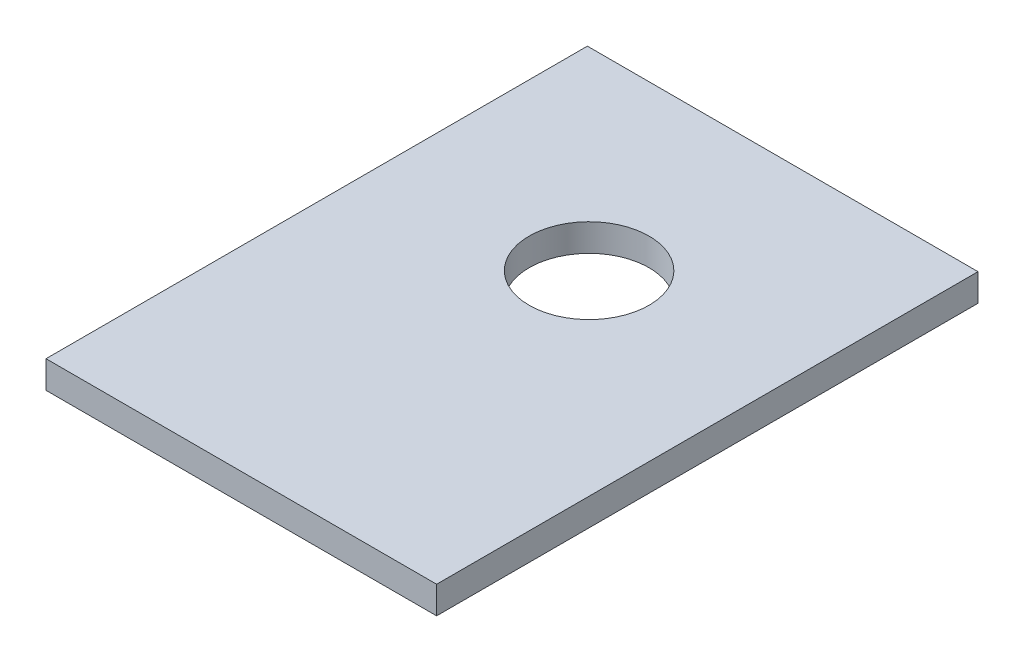
ISO-10303-21;
HEADER;
FILE_DESCRIPTION(('STEP AP214'),'2;1');
FILE_NAME('part.step','',(''),(''),'','','');
FILE_SCHEMA(('AUTOMOTIVE_DESIGN { 1 0 10303 214 1 1 1 1 }'));
ENDSEC;
DATA;
#1=APPLICATION_CONTEXT('core data for automotive mechanical design processes');
#2=APPLICATION_PROTOCOL_DEFINITION('international standard','automotive_design',2000,#1);
#3=PRODUCT_CONTEXT('',#1,'mechanical');
#4=PRODUCT('Part','Part','',(#3));
#5=PRODUCT_RELATED_PRODUCT_CATEGORY('part','',(#4));
#6=PRODUCT_DEFINITION_FORMATION('','',#4);
#7=PRODUCT_DEFINITION_CONTEXT('part definition',#1,'design');
#8=PRODUCT_DEFINITION('design','',#6,#7);
#9=PRODUCT_DEFINITION_SHAPE('','',#8);
#10=(LENGTH_UNIT() NAMED_UNIT(*) SI_UNIT(.MILLI.,.METRE.));
#11=(NAMED_UNIT(*) PLANE_ANGLE_UNIT() SI_UNIT($,.RADIAN.));
#12=(NAMED_UNIT(*) SI_UNIT($,.STERADIAN.) SOLID_ANGLE_UNIT());
#13=UNCERTAINTY_MEASURE_WITH_UNIT(LENGTH_MEASURE(1.E-05),#10,'distance_accuracy_value','');
#14=(GEOMETRIC_REPRESENTATION_CONTEXT(3) GLOBAL_UNCERTAINTY_ASSIGNED_CONTEXT((#13)) GLOBAL_UNIT_ASSIGNED_CONTEXT((#10,
#11,#12)) REPRESENTATION_CONTEXT('',''));
#15=CARTESIAN_POINT('',(0.,0.,0.));
#16=DIRECTION('',(0.,0.,1.));
#17=DIRECTION('',(1.,0.,0.));
#18=AXIS2_PLACEMENT_3D('',#15,#16,#17);
#19=CARTESIAN_POINT('',(52.,-122.,105.));
#20=DIRECTION('',(0.,1.,0.));
#21=DIRECTION('',(1.,0.,0.));
#22=AXIS2_PLACEMENT_3D('',#19,#20,#21);
#23=PLANE('',#22);
#24=CARTESIAN_POINT('',(52.,-122.,105.));
#25=DIRECTION('',(0.,1.,0.));
#26=DIRECTION('',(0.,0.,1.));
#27=AXIS2_PLACEMENT_3D('',#24,#25,#26);
#28=CIRCLE('',#27,2.1);
#29=CARTESIAN_POINT('',(52.,-122.,107.1));
#30=VERTEX_POINT('',#29);
#31=EDGE_CURVE('E10',#30,#30,#28,.T.);
#32=ORIENTED_EDGE('',*,*,#31,.F.);
#33=EDGE_LOOP('',(#32));
#34=FACE_BOUND('',#33,.T.);
#35=ADVANCED_FACE('F16',(#34),#23,.F.);
#36=CARTESIAN_POINT('',(26.,-122.,150.03332099679));
#37=DIRECTION('',(0.,1.,0.));
#38=DIRECTION('',(1.,0.,0.));
#39=AXIS2_PLACEMENT_3D('',#36,#37,#38);
#40=PLANE('',#39);
#41=CARTESIAN_POINT('',(26.,-122.,150.03332099679));
#42=DIRECTION('',(0.,1.,0.));
#43=DIRECTION('',(0.,0.,1.));
#44=AXIS2_PLACEMENT_3D('',#41,#42,#43);
#45=CIRCLE('',#44,2.1);
#46=CARTESIAN_POINT('',(26.,-122.,152.13332099679));
#47=VERTEX_POINT('',#46);
#48=EDGE_CURVE('E160',#47,#47,#45,.T.);
#49=ORIENTED_EDGE('',*,*,#48,.F.);
#50=EDGE_LOOP('',(#49));
#51=FACE_BOUND('',#50,.T.);
#52=ADVANCED_FACE('F290',(#51),#40,.F.);
#53=CARTESIAN_POINT('',(26.,-122.,59.966679003209));
#54=DIRECTION('',(0.,1.,0.));
#55=DIRECTION('',(1.,0.,0.));
#56=AXIS2_PLACEMENT_3D('',#53,#54,#55);
#57=PLANE('',#56);
#58=CARTESIAN_POINT('',(26.,-122.,59.966679003209));
#59=DIRECTION('',(0.,1.,0.));
#60=DIRECTION('',(0.,0.,1.));
#61=AXIS2_PLACEMENT_3D('',#58,#59,#60);
#62=CIRCLE('',#61,2.1);
#63=CARTESIAN_POINT('',(26.,-122.,62.066679003209));
#64=VERTEX_POINT('',#63);
#65=EDGE_CURVE('E189',#64,#64,#62,.T.);
#66=ORIENTED_EDGE('',*,*,#65,.F.);
#67=EDGE_LOOP('',(#66));
#68=FACE_BOUND('',#67,.T.);
#69=ADVANCED_FACE('F295',(#68),#57,.F.);
#70=CARTESIAN_POINT('',(-26.,-122.,150.03332099679));
#71=DIRECTION('',(0.,1.,0.));
#72=DIRECTION('',(1.,0.,0.));
#73=AXIS2_PLACEMENT_3D('',#70,#71,#72);
#74=PLANE('',#73);
#75=CARTESIAN_POINT('',(-26.,-122.,150.03332099679));
#76=DIRECTION('',(0.,1.,0.));
#77=DIRECTION('',(0.,0.,1.));
#78=AXIS2_PLACEMENT_3D('',#75,#76,#77);
#79=CIRCLE('',#78,2.1);
#80=CARTESIAN_POINT('',(-26.,-122.,152.13332099679));
#81=VERTEX_POINT('',#80);
#82=EDGE_CURVE('E183',#81,#81,#79,.T.);
#83=ORIENTED_EDGE('',*,*,#82,.F.);
#84=EDGE_LOOP('',(#83));
#85=FACE_BOUND('',#84,.T.);
#86=ADVANCED_FACE('F313',(#85),#74,.F.);
#87=CARTESIAN_POINT('',(-52.,-122.,105.));
#88=DIRECTION('',(0.,1.,0.));
#89=DIRECTION('',(1.,0.,0.));
#90=AXIS2_PLACEMENT_3D('',#87,#88,#89);
#91=PLANE('',#90);
#92=CARTESIAN_POINT('',(-52.,-122.,105.));
#93=DIRECTION('',(0.,1.,0.));
#94=DIRECTION('',(0.,0.,1.));
#95=AXIS2_PLACEMENT_3D('',#92,#93,#94);
#96=CIRCLE('',#95,2.1);
#97=CARTESIAN_POINT('',(-52.,-122.,107.1));
#98=VERTEX_POINT('',#97);
#99=EDGE_CURVE('E140',#98,#98,#96,.T.);
#100=ORIENTED_EDGE('',*,*,#99,.F.);
#101=EDGE_LOOP('',(#100));
#102=FACE_BOUND('',#101,.T.);
#103=ADVANCED_FACE('F315',(#102),#91,.F.);
#104=CARTESIAN_POINT('',(-26.,-122.,59.966679003209));
#105=DIRECTION('',(0.,1.,0.));
#106=DIRECTION('',(1.,0.,0.));
#107=AXIS2_PLACEMENT_3D('',#104,#105,#106);
#108=PLANE('',#107);
#109=CARTESIAN_POINT('',(-26.,-122.,59.966679003209));
#110=DIRECTION('',(0.,1.,0.));
#111=DIRECTION('',(0.,0.,1.));
#112=AXIS2_PLACEMENT_3D('',#109,#110,#111);
#113=CIRCLE('',#112,2.1);
#114=CARTESIAN_POINT('',(-26.,-122.,62.066679003209));
#115=VERTEX_POINT('',#114);
#116=EDGE_CURVE('E126',#115,#115,#113,.T.);
#117=ORIENTED_EDGE('',*,*,#116,.F.);
#118=EDGE_LOOP('',(#117));
#119=FACE_BOUND('',#118,.T.);
#120=ADVANCED_FACE('F318',(#119),#108,.F.);
#121=CARTESIAN_POINT('',(52.,-132.,105.));
#122=DIRECTION('',(0.,1.,0.));
#123=DIRECTION('',(0.,0.,1.));
#124=AXIS2_PLACEMENT_3D('',#121,#122,#123);
#125=CYLINDRICAL_SURFACE('',#124,2.1);
#126=DIRECTION('',(0.,1.,0.));
#127=VECTOR('',#126,1.);
#128=CARTESIAN_POINT('',(52.,-132.,107.1));
#129=LINE('',#128,#127);
#130=CARTESIAN_POINT('',(52.,-132.,107.1));
#131=VERTEX_POINT('',#130);
#132=EDGE_CURVE('E27',#131,#30,#129,.T.);
#133=ORIENTED_EDGE('',*,*,#132,.F.);
#134=CARTESIAN_POINT('',(52.,-132.,105.));
#135=DIRECTION('',(0.,1.,0.));
#136=DIRECTION('',(0.,0.,1.));
#137=AXIS2_PLACEMENT_3D('',#134,#135,#136);
#138=CIRCLE('',#137,2.1);
#139=EDGE_CURVE('E181',#131,#131,#138,.T.);
#140=ORIENTED_EDGE('',*,*,#139,.F.);
#141=ORIENTED_EDGE('',*,*,#132,.T.);
#142=ORIENTED_EDGE('',*,*,#31,.T.);
#143=EDGE_LOOP('',(#133,#140,#141,#142));
#144=FACE_BOUND('',#143,.T.);
#145=ADVANCED_FACE('F322',(#144),#125,.F.);
#146=CARTESIAN_POINT('',(26.,-132.,150.03332099679));
#147=DIRECTION('',(0.,1.,0.));
#148=DIRECTION('',(0.,0.,1.));
#149=AXIS2_PLACEMENT_3D('',#146,#147,#148);
#150=CYLINDRICAL_SURFACE('',#149,2.1);
#151=DIRECTION('',(0.,1.,0.));
#152=VECTOR('',#151,1.);
#153=CARTESIAN_POINT('',(26.,-132.,152.13332099679));
#154=LINE('',#153,#152);
#155=CARTESIAN_POINT('',(26.,-132.,152.13332099679));
#156=VERTEX_POINT('',#155);
#157=EDGE_CURVE('E147',#156,#47,#154,.T.);
#158=ORIENTED_EDGE('',*,*,#157,.F.);
#159=CARTESIAN_POINT('',(26.,-132.,150.03332099679));
#160=DIRECTION('',(0.,1.,0.));
#161=DIRECTION('',(0.,0.,1.));
#162=AXIS2_PLACEMENT_3D('',#159,#160,#161);
#163=CIRCLE('',#162,2.1);
#164=EDGE_CURVE('E158',#156,#156,#163,.T.);
#165=ORIENTED_EDGE('',*,*,#164,.F.);
#166=ORIENTED_EDGE('',*,*,#157,.T.);
#167=ORIENTED_EDGE('',*,*,#48,.T.);
#168=EDGE_LOOP('',(#158,#165,#166,#167));
#169=FACE_BOUND('',#168,.T.);
#170=ADVANCED_FACE('F302',(#169),#150,.F.);
#171=CARTESIAN_POINT('',(0.,-134.,105.));
#172=DIRECTION('',(0.,1.,0.));
#173=DIRECTION('',(0.,0.,1.));
#174=AXIS2_PLACEMENT_3D('',#171,#172,#173);
#175=CYLINDRICAL_SURFACE('',#174,35.);
#176=DIRECTION('',(0.,1.,0.));
#177=VECTOR('',#176,1.);
#178=CARTESIAN_POINT('',(0.,-134.,140.));
#179=LINE('',#178,#177);
#180=CARTESIAN_POINT('',(0.,-132.,140.));
#181=VERTEX_POINT('',#180);
#182=CARTESIAN_POINT('',(0.,-116.,140.));
#183=VERTEX_POINT('',#182);
#184=EDGE_CURVE('E186',#181,#183,#179,.T.);
#185=ORIENTED_EDGE('',*,*,#184,.F.);
#186=CARTESIAN_POINT('',(0.,-132.,105.));
#187=DIRECTION('',(0.,1.,0.));
#188=DIRECTION('',(0.,0.,1.));
#189=AXIS2_PLACEMENT_3D('',#186,#187,#188);
#190=CIRCLE('',#189,35.);
#191=EDGE_CURVE('E154',#181,#181,#190,.T.);
#192=ORIENTED_EDGE('',*,*,#191,.F.);
#193=ORIENTED_EDGE('',*,*,#184,.T.);
#194=CARTESIAN_POINT('',(0.,-116.,105.));
#195=DIRECTION('',(0.,1.,0.));
#196=DIRECTION('',(0.,0.,1.));
#197=AXIS2_PLACEMENT_3D('',#194,#195,#196);
#198=CIRCLE('',#197,35.);
#199=EDGE_CURVE('E163',#183,#183,#198,.T.);
#200=ORIENTED_EDGE('',*,*,#199,.T.);
#201=EDGE_LOOP('',(#185,#192,#193,#200));
#202=FACE_BOUND('',#201,.T.);
#203=ADVANCED_FACE('F299',(#202),#175,.F.);
#204=CARTESIAN_POINT('',(26.,-132.,59.966679003209));
#205=DIRECTION('',(0.,1.,0.));
#206=DIRECTION('',(0.,0.,1.));
#207=AXIS2_PLACEMENT_3D('',#204,#205,#206);
#208=CYLINDRICAL_SURFACE('',#207,2.1);
#209=DIRECTION('',(0.,1.,0.));
#210=VECTOR('',#209,1.);
#211=CARTESIAN_POINT('',(26.,-132.,62.066679003209));
#212=LINE('',#211,#210);
#213=CARTESIAN_POINT('',(26.,-132.,62.066679003209));
#214=VERTEX_POINT('',#213);
#215=EDGE_CURVE('E20',#214,#64,#212,.T.);
#216=ORIENTED_EDGE('',*,*,#215,.F.);
#217=CARTESIAN_POINT('',(26.,-132.,59.966679003209));
#218=DIRECTION('',(0.,1.,0.));
#219=DIRECTION('',(0.,0.,1.));
#220=AXIS2_PLACEMENT_3D('',#217,#218,#219);
#221=CIRCLE('',#220,2.1);
#222=EDGE_CURVE('E159',#214,#214,#221,.T.);
#223=ORIENTED_EDGE('',*,*,#222,.F.);
#224=ORIENTED_EDGE('',*,*,#215,.T.);
#225=ORIENTED_EDGE('',*,*,#65,.T.);
#226=EDGE_LOOP('',(#216,#223,#224,#225));
#227=FACE_BOUND('',#226,.T.);
#228=ADVANCED_FACE('F301',(#227),#208,.F.);
#229=CARTESIAN_POINT('',(-26.,-132.,150.03332099679));
#230=DIRECTION('',(0.,1.,0.));
#231=DIRECTION('',(0.,0.,1.));
#232=AXIS2_PLACEMENT_3D('',#229,#230,#231);
#233=CYLINDRICAL_SURFACE('',#232,2.1);
#234=DIRECTION('',(0.,1.,0.));
#235=VECTOR('',#234,1.);
#236=CARTESIAN_POINT('',(-26.,-132.,152.13332099679));
#237=LINE('',#236,#235);
#238=CARTESIAN_POINT('',(-26.,-132.,152.13332099679));
#239=VERTEX_POINT('',#238);
#240=EDGE_CURVE('E117',#239,#81,#237,.T.);
#241=ORIENTED_EDGE('',*,*,#240,.F.);
#242=CARTESIAN_POINT('',(-26.,-132.,150.03332099679));
#243=DIRECTION('',(0.,1.,0.));
#244=DIRECTION('',(0.,0.,1.));
#245=AXIS2_PLACEMENT_3D('',#242,#243,#244);
#246=CIRCLE('',#245,2.1);
#247=EDGE_CURVE('E170',#239,#239,#246,.T.);
#248=ORIENTED_EDGE('',*,*,#247,.F.);
#249=ORIENTED_EDGE('',*,*,#240,.T.);
#250=ORIENTED_EDGE('',*,*,#82,.T.);
#251=EDGE_LOOP('',(#241,#248,#249,#250));
#252=FACE_BOUND('',#251,.T.);
#253=ADVANCED_FACE('F232',(#252),#233,.F.);
#254=CARTESIAN_POINT('',(-52.,-132.,105.));
#255=DIRECTION('',(0.,1.,0.));
#256=DIRECTION('',(0.,0.,1.));
#257=AXIS2_PLACEMENT_3D('',#254,#255,#256);
#258=CYLINDRICAL_SURFACE('',#257,2.1);
#259=DIRECTION('',(0.,1.,0.));
#260=VECTOR('',#259,1.);
#261=CARTESIAN_POINT('',(-52.,-132.,107.1));
#262=LINE('',#261,#260);
#263=CARTESIAN_POINT('',(-52.,-132.,107.1));
#264=VERTEX_POINT('',#263);
#265=EDGE_CURVE('E133',#264,#98,#262,.T.);
#266=ORIENTED_EDGE('',*,*,#265,.F.);
#267=CARTESIAN_POINT('',(-52.,-132.,105.));
#268=DIRECTION('',(0.,1.,0.));
#269=DIRECTION('',(0.,0.,1.));
#270=AXIS2_PLACEMENT_3D('',#267,#268,#269);
#271=CIRCLE('',#270,2.1);
#272=EDGE_CURVE('E225',#264,#264,#271,.T.);
#273=ORIENTED_EDGE('',*,*,#272,.F.);
#274=ORIENTED_EDGE('',*,*,#265,.T.);
#275=ORIENTED_EDGE('',*,*,#99,.T.);
#276=EDGE_LOOP('',(#266,#273,#274,#275));
#277=FACE_BOUND('',#276,.T.);
#278=ADVANCED_FACE('F307',(#277),#258,.F.);
#279=CARTESIAN_POINT('',(-26.,-132.,59.966679003209));
#280=DIRECTION('',(0.,1.,0.));
#281=DIRECTION('',(0.,0.,1.));
#282=AXIS2_PLACEMENT_3D('',#279,#280,#281);
#283=CYLINDRICAL_SURFACE('',#282,2.1);
#284=DIRECTION('',(0.,1.,0.));
#285=VECTOR('',#284,1.);
#286=CARTESIAN_POINT('',(-26.,-132.,62.066679003209));
#287=LINE('',#286,#285);
#288=CARTESIAN_POINT('',(-26.,-132.,62.066679003209));
#289=VERTEX_POINT('',#288);
#290=EDGE_CURVE('E129',#289,#115,#287,.T.);
#291=ORIENTED_EDGE('',*,*,#290,.F.);
#292=CARTESIAN_POINT('',(-26.,-132.,59.966679003209));
#293=DIRECTION('',(0.,1.,0.));
#294=DIRECTION('',(0.,0.,1.));
#295=AXIS2_PLACEMENT_3D('',#292,#293,#294);
#296=CIRCLE('',#295,2.1);
#297=EDGE_CURVE('E152',#289,#289,#296,.T.);
#298=ORIENTED_EDGE('',*,*,#297,.F.);
#299=ORIENTED_EDGE('',*,*,#290,.T.);
#300=ORIENTED_EDGE('',*,*,#116,.T.);
#301=EDGE_LOOP('',(#291,#298,#299,#300));
#302=FACE_BOUND('',#301,.T.);
#303=ADVANCED_FACE('F127',(#302),#283,.F.);
#304=CARTESIAN_POINT('',(114.,-132.,-8.));
#305=DIRECTION('',(1.,0.,0.));
#306=DIRECTION('',(0.,1.,0.));
#307=AXIS2_PLACEMENT_3D('',#304,#305,#306);
#308=PLANE('',#307);
#309=DIRECTION('',(0.,0.,1.));
#310=VECTOR('',#309,1.);
#311=CARTESIAN_POINT('',(114.,-132.,-8.));
#312=LINE('',#311,#310);
#313=CARTESIAN_POINT('',(114.,-132.,-8.));
#314=VERTEX_POINT('',#313);
#315=CARTESIAN_POINT('',(114.,-132.,308.));
#316=VERTEX_POINT('',#315);
#317=EDGE_CURVE('E193',#314,#316,#312,.T.);
#318=ORIENTED_EDGE('',*,*,#317,.F.);
#319=DIRECTION('',(0.,1.,0.));
#320=VECTOR('',#319,1.);
#321=CARTESIAN_POINT('',(114.,-132.,-8.));
#322=LINE('',#321,#320);
#323=CARTESIAN_POINT('',(114.,-116.,-8.));
#324=VERTEX_POINT('',#323);
#325=EDGE_CURVE('E143',#314,#324,#322,.T.);
#326=ORIENTED_EDGE('',*,*,#325,.T.);
#327=DIRECTION('',(0.,0.,1.));
#328=VECTOR('',#327,1.);
#329=CARTESIAN_POINT('',(114.,-116.,-8.));
#330=LINE('',#329,#328);
#331=CARTESIAN_POINT('',(114.,-116.,308.));
#332=VERTEX_POINT('',#331);
#333=EDGE_CURVE('E167',#324,#332,#330,.T.);
#334=ORIENTED_EDGE('',*,*,#333,.T.);
#335=DIRECTION('',(0.,1.,0.));
#336=VECTOR('',#335,1.);
#337=CARTESIAN_POINT('',(114.,-132.,308.));
#338=LINE('',#337,#336);
#339=EDGE_CURVE('E177',#316,#332,#338,.T.);
#340=ORIENTED_EDGE('',*,*,#339,.F.);
#341=EDGE_LOOP('',(#318,#326,#334,#340));
#342=FACE_BOUND('',#341,.T.);
#343=ADVANCED_FACE('F310',(#342),#308,.T.);
#344=CARTESIAN_POINT('',(-114.,-132.,-8.));
#345=DIRECTION('',(0.,0.,1.));
#346=DIRECTION('',(1.,0.,0.));
#347=AXIS2_PLACEMENT_3D('',#344,#345,#346);
#348=PLANE('',#347);
#349=DIRECTION('',(1.,0.,0.));
#350=VECTOR('',#349,1.);
#351=CARTESIAN_POINT('',(-114.,-116.,-8.));
#352=LINE('',#351,#350);
#353=CARTESIAN_POINT('',(-114.,-116.,-8.));
#354=VERTEX_POINT('',#353);
#355=EDGE_CURVE('E197',#354,#324,#352,.T.);
#356=ORIENTED_EDGE('',*,*,#355,.T.);
#357=ORIENTED_EDGE('',*,*,#325,.F.);
#358=DIRECTION('',(1.,0.,0.));
#359=VECTOR('',#358,1.);
#360=CARTESIAN_POINT('',(-114.,-132.,-8.));
#361=LINE('',#360,#359);
#362=CARTESIAN_POINT('',(-114.,-132.,-8.));
#363=VERTEX_POINT('',#362);
#364=EDGE_CURVE('E149',#363,#314,#361,.T.);
#365=ORIENTED_EDGE('',*,*,#364,.F.);
#366=DIRECTION('',(0.,1.,0.));
#367=VECTOR('',#366,1.);
#368=CARTESIAN_POINT('',(-114.,-132.,-8.));
#369=LINE('',#368,#367);
#370=EDGE_CURVE('E171',#363,#354,#369,.T.);
#371=ORIENTED_EDGE('',*,*,#370,.T.);
#372=EDGE_LOOP('',(#356,#357,#365,#371));
#373=FACE_BOUND('',#372,.T.);
#374=ADVANCED_FACE('F248',(#373),#348,.F.);
#375=CARTESIAN_POINT('',(-114.,-116.,-8.));
#376=DIRECTION('',(0.,1.,0.));
#377=DIRECTION('',(1.,0.,0.));
#378=AXIS2_PLACEMENT_3D('',#375,#376,#377);
#379=PLANE('',#378);
#380=ORIENTED_EDGE('',*,*,#199,.F.);
#381=EDGE_LOOP('',(#380));
#382=FACE_BOUND('',#381,.T.);
#383=ORIENTED_EDGE('',*,*,#355,.F.);
#384=DIRECTION('',(0.,0.,1.));
#385=VECTOR('',#384,1.);
#386=CARTESIAN_POINT('',(-114.,-116.,-8.));
#387=LINE('',#386,#385);
#388=CARTESIAN_POINT('',(-114.,-116.,308.));
#389=VERTEX_POINT('',#388);
#390=EDGE_CURVE('E176',#354,#389,#387,.T.);
#391=ORIENTED_EDGE('',*,*,#390,.T.);
#392=DIRECTION('',(1.,0.,0.));
#393=VECTOR('',#392,1.);
#394=CARTESIAN_POINT('',(-114.,-116.,308.));
#395=LINE('',#394,#393);
#396=EDGE_CURVE('E180',#389,#332,#395,.T.);
#397=ORIENTED_EDGE('',*,*,#396,.T.);
#398=ORIENTED_EDGE('',*,*,#333,.F.);
#399=EDGE_LOOP('',(#383,#391,#397,#398));
#400=FACE_BOUND('',#399,.T.);
#401=ADVANCED_FACE('F244',(#382,#400),#379,.T.);
#402=CARTESIAN_POINT('',(-114.,-132.,308.));
#403=DIRECTION('',(0.,0.,1.));
#404=DIRECTION('',(1.,0.,0.));
#405=AXIS2_PLACEMENT_3D('',#402,#403,#404);
#406=PLANE('',#405);
#407=DIRECTION('',(0.,1.,0.));
#408=VECTOR('',#407,1.);
#409=CARTESIAN_POINT('',(-114.,-132.,308.));
#410=LINE('',#409,#408);
#411=CARTESIAN_POINT('',(-114.,-132.,308.));
#412=VERTEX_POINT('',#411);
#413=EDGE_CURVE('E200',#412,#389,#410,.T.);
#414=ORIENTED_EDGE('',*,*,#413,.F.);
#415=DIRECTION('',(1.,0.,0.));
#416=VECTOR('',#415,1.);
#417=CARTESIAN_POINT('',(-114.,-132.,308.));
#418=LINE('',#417,#416);
#419=EDGE_CURVE('E153',#412,#316,#418,.T.);
#420=ORIENTED_EDGE('',*,*,#419,.T.);
#421=ORIENTED_EDGE('',*,*,#339,.T.);
#422=ORIENTED_EDGE('',*,*,#396,.F.);
#423=EDGE_LOOP('',(#414,#420,#421,#422));
#424=FACE_BOUND('',#423,.T.);
#425=ADVANCED_FACE('F280',(#424),#406,.T.);
#426=CARTESIAN_POINT('',(-114.,-132.,-8.));
#427=DIRECTION('',(0.,1.,0.));
#428=DIRECTION('',(1.,0.,0.));
#429=AXIS2_PLACEMENT_3D('',#426,#427,#428);
#430=PLANE('',#429);
#431=ORIENTED_EDGE('',*,*,#139,.T.);
#432=EDGE_LOOP('',(#431));
#433=FACE_BOUND('',#432,.T.);
#434=ORIENTED_EDGE('',*,*,#164,.T.);
#435=EDGE_LOOP('',(#434));
#436=FACE_BOUND('',#435,.T.);
#437=ORIENTED_EDGE('',*,*,#191,.T.);
#438=EDGE_LOOP('',(#437));
#439=FACE_BOUND('',#438,.T.);
#440=ORIENTED_EDGE('',*,*,#222,.T.);
#441=EDGE_LOOP('',(#440));
#442=FACE_BOUND('',#441,.T.);
#443=ORIENTED_EDGE('',*,*,#247,.T.);
#444=EDGE_LOOP('',(#443));
#445=FACE_BOUND('',#444,.T.);
#446=ORIENTED_EDGE('',*,*,#272,.T.);
#447=EDGE_LOOP('',(#446));
#448=FACE_BOUND('',#447,.T.);
#449=ORIENTED_EDGE('',*,*,#297,.T.);
#450=EDGE_LOOP('',(#449));
#451=FACE_BOUND('',#450,.T.);
#452=ORIENTED_EDGE('',*,*,#317,.T.);
#453=ORIENTED_EDGE('',*,*,#419,.F.);
#454=DIRECTION('',(0.,0.,1.));
#455=VECTOR('',#454,1.);
#456=CARTESIAN_POINT('',(-114.,-132.,-8.));
#457=LINE('',#456,#455);
#458=EDGE_CURVE('E175',#363,#412,#457,.T.);
#459=ORIENTED_EDGE('',*,*,#458,.F.);
#460=ORIENTED_EDGE('',*,*,#364,.T.);
#461=EDGE_LOOP('',(#452,#453,#459,#460));
#462=FACE_BOUND('',#461,.T.);
#463=ADVANCED_FACE('F18',(#433,#436,#439,#442,#445,#448,#451,#462),#430,.F.);
#464=CARTESIAN_POINT('',(-114.,-132.,-8.));
#465=DIRECTION('',(1.,0.,0.));
#466=DIRECTION('',(0.,1.,0.));
#467=AXIS2_PLACEMENT_3D('',#464,#465,#466);
#468=PLANE('',#467);
#469=ORIENTED_EDGE('',*,*,#413,.T.);
#470=ORIENTED_EDGE('',*,*,#390,.F.);
#471=ORIENTED_EDGE('',*,*,#370,.F.);
#472=ORIENTED_EDGE('',*,*,#458,.T.);
#473=EDGE_LOOP('',(#469,#470,#471,#472));
#474=FACE_BOUND('',#473,.T.);
#475=ADVANCED_FACE('F252',(#474),#468,.F.);
#476=CLOSED_SHELL('',(#35,#52,#69,#86,#103,#120,#145,#170,#203,#228,#253,#278,#303,#343,#374,
#401,#425,#463,#475));
#477=MANIFOLD_SOLID_BREP('B1',#476);
#478=ADVANCED_BREP_SHAPE_REPRESENTATION('',(#18,#477),#14);
#479=SHAPE_DEFINITION_REPRESENTATION(#9,#478);
ENDSEC;
END-ISO-10303-21;
